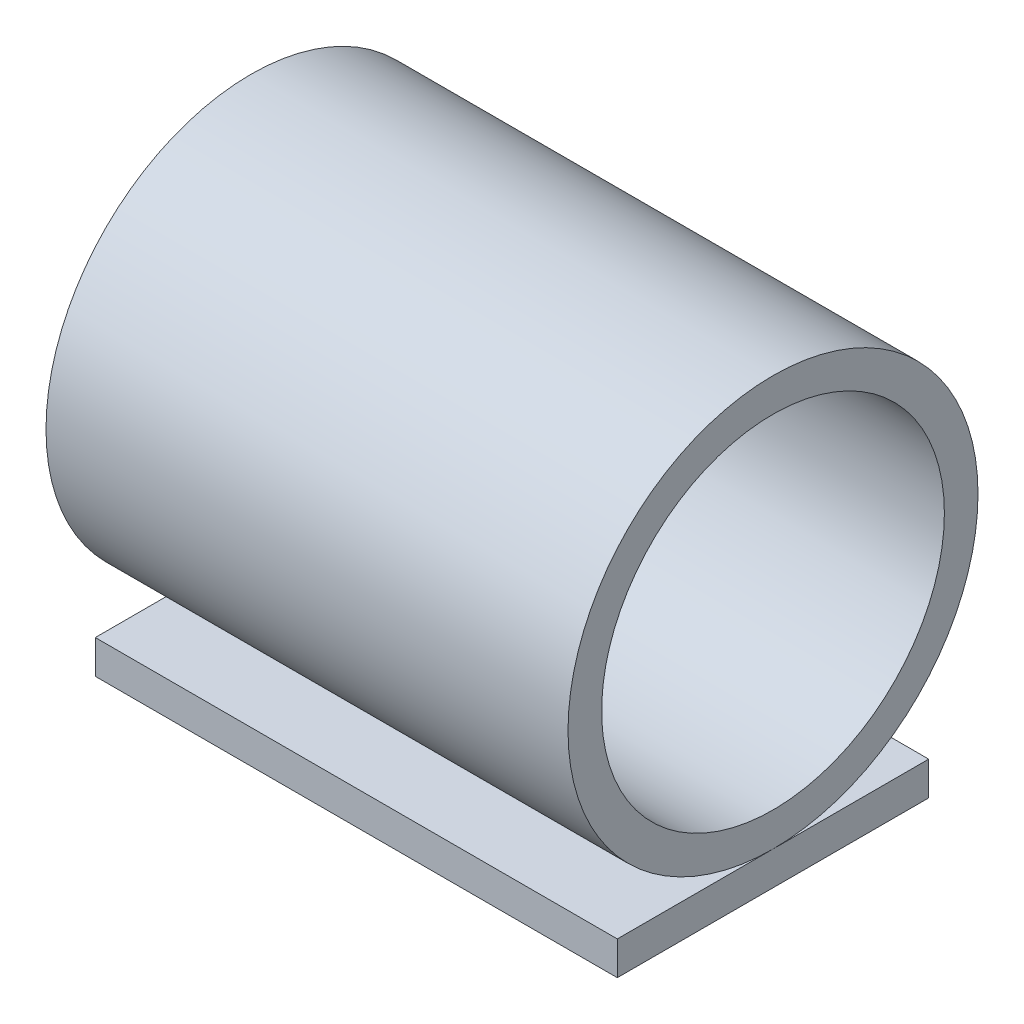
ISO-10303-21;
HEADER;
FILE_DESCRIPTION(('STEP AP214'),'2;1');
FILE_NAME('part.step','',(''),(''),'','','');
FILE_SCHEMA(('AUTOMOTIVE_DESIGN { 1 0 10303 214 1 1 1 1 }'));
ENDSEC;
DATA;
#1=APPLICATION_CONTEXT('core data for automotive mechanical design processes');
#2=APPLICATION_PROTOCOL_DEFINITION('international standard','automotive_design',2000,#1);
#3=PRODUCT_CONTEXT('',#1,'mechanical');
#4=PRODUCT('Part','Part','',(#3));
#5=PRODUCT_RELATED_PRODUCT_CATEGORY('part','',(#4));
#6=PRODUCT_DEFINITION_FORMATION('','',#4);
#7=PRODUCT_DEFINITION_CONTEXT('part definition',#1,'design');
#8=PRODUCT_DEFINITION('design','',#6,#7);
#9=PRODUCT_DEFINITION_SHAPE('','',#8);
#10=(LENGTH_UNIT() NAMED_UNIT(*) SI_UNIT(.MILLI.,.METRE.));
#11=(NAMED_UNIT(*) PLANE_ANGLE_UNIT() SI_UNIT($,.RADIAN.));
#12=(NAMED_UNIT(*) SI_UNIT($,.STERADIAN.) SOLID_ANGLE_UNIT());
#13=UNCERTAINTY_MEASURE_WITH_UNIT(LENGTH_MEASURE(1.E-05),#10,'distance_accuracy_value','');
#14=(GEOMETRIC_REPRESENTATION_CONTEXT(3) GLOBAL_UNCERTAINTY_ASSIGNED_CONTEXT((#13)) GLOBAL_UNIT_ASSIGNED_CONTEXT((#10,
#11,#12)) REPRESENTATION_CONTEXT('',''));
#15=CARTESIAN_POINT('',(0.,0.,0.));
#16=DIRECTION('',(0.,0.,1.));
#17=DIRECTION('',(1.,0.,0.));
#18=AXIS2_PLACEMENT_3D('',#15,#16,#17);
#19=CARTESIAN_POINT('',(-46.6,21.3,6.55063558778479E-06));
#20=DIRECTION('',(1.,0.,0.));
#21=DIRECTION('',(0.,0.,-1.));
#22=AXIS2_PLACEMENT_3D('',#19,#20,#21);
#23=CYLINDRICAL_SURFACE('',#22,18.3);
#24=CARTESIAN_POINT('',(-46.6,21.3,6.55063558778479E-06));
#25=DIRECTION('',(1.,0.,0.));
#26=DIRECTION('',(0.,0.,-1.));
#27=AXIS2_PLACEMENT_3D('',#24,#25,#26);
#28=CIRCLE('',#27,18.3);
#29=CARTESIAN_POINT('',(-46.6,21.3,-18.2999934493644));
#30=VERTEX_POINT('',#29);
#31=EDGE_CURVE('E11',#30,#30,#28,.T.);
#32=ORIENTED_EDGE('',*,*,#31,.T.);
#33=EDGE_LOOP('',(#32));
#34=FACE_BOUND('',#33,.T.);
#35=CARTESIAN_POINT('',(0.,21.3,6.55063558778479E-06));
#36=DIRECTION('',(1.,0.,0.));
#37=DIRECTION('',(0.,0.,-1.));
#38=AXIS2_PLACEMENT_3D('',#35,#36,#37);
#39=CIRCLE('',#38,18.3);
#40=CARTESIAN_POINT('',(0.,21.3,-18.2999934493644));
#41=VERTEX_POINT('',#40);
#42=EDGE_CURVE('E44',#41,#41,#39,.T.);
#43=ORIENTED_EDGE('',*,*,#42,.F.);
#44=EDGE_LOOP('',(#43));
#45=FACE_BOUND('',#44,.T.);
#46=ADVANCED_FACE('F41',(#34,#45),#23,.T.);
#47=CARTESIAN_POINT('',(-46.6,21.3,6.55063558778479E-06));
#48=DIRECTION('',(1.,0.,0.));
#49=DIRECTION('',(0.,0.,-1.));
#50=AXIS2_PLACEMENT_3D('',#47,#48,#49);
#51=PLANE('',#50);
#52=CARTESIAN_POINT('',(-46.6,21.3151641695859,0.));
#53=DIRECTION('',(1.,0.,0.));
#54=DIRECTION('',(0.,0.,-1.));
#55=AXIS2_PLACEMENT_3D('',#52,#53,#54);
#56=CIRCLE('',#55,15.3);
#57=CARTESIAN_POINT('',(-46.6,21.3151641695859,-15.3));
#58=VERTEX_POINT('',#57);
#59=EDGE_CURVE('E51',#58,#58,#56,.T.);
#60=ORIENTED_EDGE('',*,*,#59,.T.);
#61=EDGE_LOOP('',(#60));
#62=FACE_BOUND('',#61,.T.);
#63=ORIENTED_EDGE('',*,*,#31,.F.);
#64=EDGE_LOOP('',(#63));
#65=FACE_BOUND('',#64,.T.);
#66=ADVANCED_FACE('F59',(#62,#65),#51,.F.);
#67=CARTESIAN_POINT('',(0.,21.3,6.55063558778479E-06));
#68=DIRECTION('',(1.,0.,0.));
#69=DIRECTION('',(0.,0.,-1.));
#70=AXIS2_PLACEMENT_3D('',#67,#68,#69);
#71=PLANE('',#70);
#72=CARTESIAN_POINT('',(0.,21.3151641695859,0.));
#73=DIRECTION('',(1.,0.,0.));
#74=DIRECTION('',(0.,0.,-1.));
#75=AXIS2_PLACEMENT_3D('',#72,#73,#74);
#76=CIRCLE('',#75,15.3);
#77=CARTESIAN_POINT('',(0.,21.3151641695859,-15.3));
#78=VERTEX_POINT('',#77);
#79=EDGE_CURVE('E53',#78,#78,#76,.T.);
#80=ORIENTED_EDGE('',*,*,#79,.F.);
#81=EDGE_LOOP('',(#80));
#82=FACE_BOUND('',#81,.T.);
#83=ORIENTED_EDGE('',*,*,#42,.T.);
#84=EDGE_LOOP('',(#83));
#85=FACE_BOUND('',#84,.T.);
#86=ADVANCED_FACE('F65',(#82,#85),#71,.T.);
#87=CARTESIAN_POINT('',(-46.6,21.3151641695859,0.));
#88=DIRECTION('',(1.,0.,0.));
#89=DIRECTION('',(0.,0.,-1.));
#90=AXIS2_PLACEMENT_3D('',#87,#88,#89);
#91=CYLINDRICAL_SURFACE('',#90,15.3);
#92=ORIENTED_EDGE('',*,*,#59,.F.);
#93=EDGE_LOOP('',(#92));
#94=FACE_BOUND('',#93,.T.);
#95=ORIENTED_EDGE('',*,*,#79,.T.);
#96=EDGE_LOOP('',(#95));
#97=FACE_BOUND('',#96,.T.);
#98=ADVANCED_FACE('F62',(#94,#97),#91,.F.);
#99=CLOSED_SHELL('',(#46,#66,#86,#98));
#100=MANIFOLD_SOLID_BREP('B2',#99);
#101=CARTESIAN_POINT('',(-46.6000027261535,3.,-13.8999934493644));
#102=DIRECTION('',(1.,0.,0.));
#103=DIRECTION('',(0.,0.,-1.));
#104=AXIS2_PLACEMENT_3D('',#101,#102,#103);
#105=PLANE('',#104);
#106=DIRECTION('',(0.,0.,1.));
#107=VECTOR('',#106,1.);
#108=CARTESIAN_POINT('',(-46.6000027261535,0.,-13.8999934493644));
#109=LINE('',#108,#107);
#110=CARTESIAN_POINT('',(-46.6000027261535,0.,-13.8999934493644));
#111=VERTEX_POINT('',#110);
#112=CARTESIAN_POINT('',(-46.6000027261535,0.,13.9000065506356));
#113=VERTEX_POINT('',#112);
#114=EDGE_CURVE('E165',#111,#113,#109,.T.);
#115=ORIENTED_EDGE('',*,*,#114,.T.);
#116=DIRECTION('',(0.,-1.,0.));
#117=VECTOR('',#116,1.);
#118=CARTESIAN_POINT('',(-46.6000027261535,3.,13.9000065506356));
#119=LINE('',#118,#117);
#120=CARTESIAN_POINT('',(-46.6000027261535,3.,13.9000065506356));
#121=VERTEX_POINT('',#120);
#122=EDGE_CURVE('E39',#121,#113,#119,.T.);
#123=ORIENTED_EDGE('',*,*,#122,.F.);
#124=DIRECTION('',(0.,0.,1.));
#125=VECTOR('',#124,1.);
#126=CARTESIAN_POINT('',(-46.6000027261535,3.,-13.8999934493644));
#127=LINE('',#126,#125);
#128=CARTESIAN_POINT('',(-46.6000027261535,3.,-13.8999934493644));
#129=VERTEX_POINT('',#128);
#130=EDGE_CURVE('E153',#129,#121,#127,.T.);
#131=ORIENTED_EDGE('',*,*,#130,.F.);
#132=DIRECTION('',(0.,-1.,0.));
#133=VECTOR('',#132,1.);
#134=CARTESIAN_POINT('',(-46.6000027261535,3.,-13.8999934493644));
#135=LINE('',#134,#133);
#136=EDGE_CURVE('E161',#129,#111,#135,.T.);
#137=ORIENTED_EDGE('',*,*,#136,.T.);
#138=EDGE_LOOP('',(#115,#123,#131,#137));
#139=FACE_BOUND('',#138,.T.);
#140=ADVANCED_FACE('F102',(#139),#105,.F.);
#141=CARTESIAN_POINT('',(-46.6000027261535,3.,13.9000065506356));
#142=DIRECTION('',(0.,0.,-1.));
#143=DIRECTION('',(-1.,0.,0.));
#144=AXIS2_PLACEMENT_3D('',#141,#142,#143);
#145=PLANE('',#144);
#146=DIRECTION('',(1.,0.,0.));
#147=VECTOR('',#146,1.);
#148=CARTESIAN_POINT('',(-46.6000027261535,0.,13.9000065506356));
#149=LINE('',#148,#147);
#150=CARTESIAN_POINT('',(-2.72615352279362E-06,0.,13.9000065506356));
#151=VERTEX_POINT('',#150);
#152=EDGE_CURVE('E157',#113,#151,#149,.T.);
#153=ORIENTED_EDGE('',*,*,#152,.T.);
#154=DIRECTION('',(0.,-1.,0.));
#155=VECTOR('',#154,1.);
#156=CARTESIAN_POINT('',(-2.72615352279362E-06,3.,13.9000065506356));
#157=LINE('',#156,#155);
#158=CARTESIAN_POINT('',(-2.72615352279362E-06,3.,13.9000065506356));
#159=VERTEX_POINT('',#158);
#160=EDGE_CURVE('E110',#159,#151,#157,.T.);
#161=ORIENTED_EDGE('',*,*,#160,.F.);
#162=DIRECTION('',(1.,0.,0.));
#163=VECTOR('',#162,1.);
#164=CARTESIAN_POINT('',(-46.6000027261535,3.,13.9000065506356));
#165=LINE('',#164,#163);
#166=EDGE_CURVE('E148',#121,#159,#165,.T.);
#167=ORIENTED_EDGE('',*,*,#166,.F.);
#168=ORIENTED_EDGE('',*,*,#122,.T.);
#169=EDGE_LOOP('',(#153,#161,#167,#168));
#170=FACE_BOUND('',#169,.T.);
#171=ADVANCED_FACE('F156',(#170),#145,.F.);
#172=CARTESIAN_POINT('',(-2.72615352619814E-06,3.,-13.8999934493644));
#173=DIRECTION('',(-1.,0.,0.));
#174=DIRECTION('',(0.,0.,1.));
#175=AXIS2_PLACEMENT_3D('',#172,#173,#174);
#176=PLANE('',#175);
#177=DIRECTION('',(0.,0.,-1.));
#178=VECTOR('',#177,1.);
#179=CARTESIAN_POINT('',(-2.72615352619814E-06,0.,-13.8999934493644));
#180=LINE('',#179,#178);
#181=CARTESIAN_POINT('',(-2.72615352619814E-06,0.,-13.8999934493644));
#182=VERTEX_POINT('',#181);
#183=EDGE_CURVE('E135',#151,#182,#180,.T.);
#184=ORIENTED_EDGE('',*,*,#183,.T.);
#185=DIRECTION('',(0.,-1.,0.));
#186=VECTOR('',#185,1.);
#187=CARTESIAN_POINT('',(-2.72615352619814E-06,3.,-13.8999934493644));
#188=LINE('',#187,#186);
#189=CARTESIAN_POINT('',(-2.72615352619814E-06,3.,-13.8999934493644));
#190=VERTEX_POINT('',#189);
#191=EDGE_CURVE('E158',#190,#182,#188,.T.);
#192=ORIENTED_EDGE('',*,*,#191,.F.);
#193=DIRECTION('',(0.,0.,-1.));
#194=VECTOR('',#193,1.);
#195=CARTESIAN_POINT('',(-2.72615352619814E-06,3.,-13.8999934493644));
#196=LINE('',#195,#194);
#197=EDGE_CURVE('E151',#159,#190,#196,.T.);
#198=ORIENTED_EDGE('',*,*,#197,.F.);
#199=ORIENTED_EDGE('',*,*,#160,.T.);
#200=EDGE_LOOP('',(#184,#192,#198,#199));
#201=FACE_BOUND('',#200,.T.);
#202=ADVANCED_FACE('F159',(#201),#176,.F.);
#203=CARTESIAN_POINT('',(-46.6000027261535,3.,-13.8999934493644));
#204=DIRECTION('',(0.,0.,1.));
#205=DIRECTION('',(1.,0.,0.));
#206=AXIS2_PLACEMENT_3D('',#203,#204,#205);
#207=PLANE('',#206);
#208=DIRECTION('',(-1.,0.,0.));
#209=VECTOR('',#208,1.);
#210=CARTESIAN_POINT('',(-46.6000027261535,0.,-13.8999934493644));
#211=LINE('',#210,#209);
#212=EDGE_CURVE('E141',#182,#111,#211,.T.);
#213=ORIENTED_EDGE('',*,*,#212,.T.);
#214=ORIENTED_EDGE('',*,*,#136,.F.);
#215=DIRECTION('',(-1.,0.,0.));
#216=VECTOR('',#215,1.);
#217=CARTESIAN_POINT('',(-46.6000027261535,3.,-13.8999934493644));
#218=LINE('',#217,#216);
#219=EDGE_CURVE('E118',#190,#129,#218,.T.);
#220=ORIENTED_EDGE('',*,*,#219,.F.);
#221=ORIENTED_EDGE('',*,*,#191,.T.);
#222=EDGE_LOOP('',(#213,#214,#220,#221));
#223=FACE_BOUND('',#222,.T.);
#224=ADVANCED_FACE('F172',(#223),#207,.F.);
#225=CARTESIAN_POINT('',(0.,3.,0.));
#226=DIRECTION('',(0.,1.,0.));
#227=DIRECTION('',(0.,0.,1.));
#228=AXIS2_PLACEMENT_3D('',#225,#226,#227);
#229=PLANE('',#228);
#230=ORIENTED_EDGE('',*,*,#130,.T.);
#231=ORIENTED_EDGE('',*,*,#166,.T.);
#232=ORIENTED_EDGE('',*,*,#197,.T.);
#233=ORIENTED_EDGE('',*,*,#219,.T.);
#234=EDGE_LOOP('',(#230,#231,#232,#233));
#235=FACE_BOUND('',#234,.T.);
#236=ADVANCED_FACE('F149',(#235),#229,.T.);
#237=CARTESIAN_POINT('',(0.,0.,0.));
#238=DIRECTION('',(0.,1.,0.));
#239=DIRECTION('',(0.,0.,1.));
#240=AXIS2_PLACEMENT_3D('',#237,#238,#239);
#241=PLANE('',#240);
#242=ORIENTED_EDGE('',*,*,#114,.F.);
#243=ORIENTED_EDGE('',*,*,#212,.F.);
#244=ORIENTED_EDGE('',*,*,#183,.F.);
#245=ORIENTED_EDGE('',*,*,#152,.F.);
#246=EDGE_LOOP('',(#242,#243,#244,#245));
#247=FACE_BOUND('',#246,.T.);
#248=ADVANCED_FACE('F175',(#247),#241,.F.);
#249=CLOSED_SHELL('',(#140,#171,#202,#224,#236,#248));
#250=MANIFOLD_SOLID_BREP('B6',#249);
#251=ADVANCED_BREP_SHAPE_REPRESENTATION('',(#18,#100,#250),#14);
#252=SHAPE_DEFINITION_REPRESENTATION(#9,#251);
ENDSEC;
END-ISO-10303-21;
